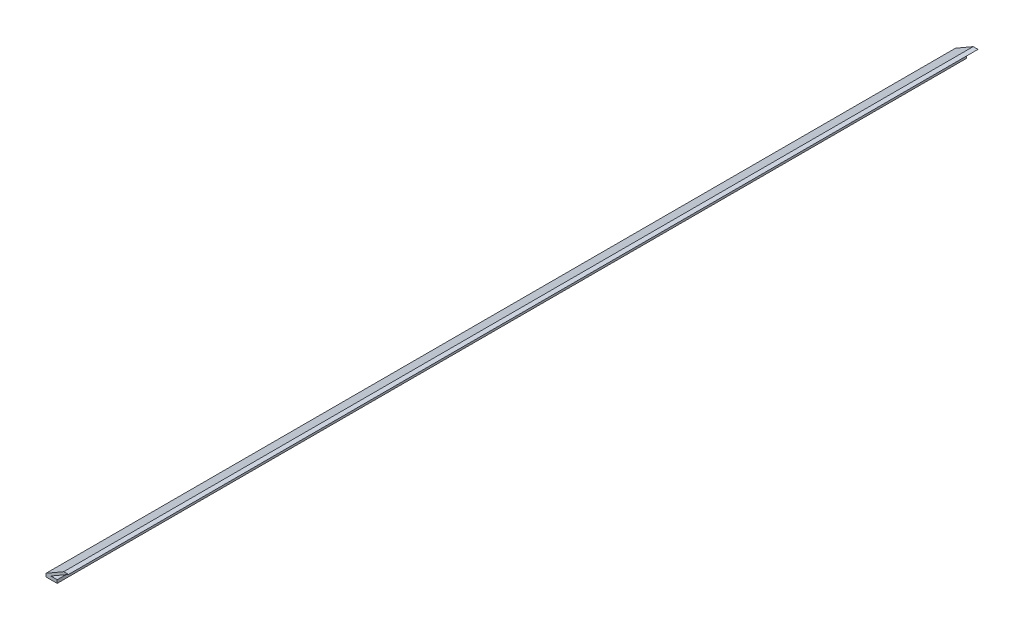
ISO-10303-21;
HEADER;
FILE_DESCRIPTION(('STEP AP214'),'2;1');
FILE_NAME('part.step','',(''),(''),'','','');
FILE_SCHEMA(('AUTOMOTIVE_DESIGN { 1 0 10303 214 1 1 1 1 }'));
ENDSEC;
DATA;
#1=APPLICATION_CONTEXT('core data for automotive mechanical design processes');
#2=APPLICATION_PROTOCOL_DEFINITION('international standard','automotive_design',2000,#1);
#3=PRODUCT_CONTEXT('',#1,'mechanical');
#4=PRODUCT('Part','Part','',(#3));
#5=PRODUCT_RELATED_PRODUCT_CATEGORY('part','',(#4));
#6=PRODUCT_DEFINITION_FORMATION('','',#4);
#7=PRODUCT_DEFINITION_CONTEXT('part definition',#1,'design');
#8=PRODUCT_DEFINITION('design','',#6,#7);
#9=PRODUCT_DEFINITION_SHAPE('','',#8);
#10=(LENGTH_UNIT() NAMED_UNIT(*) SI_UNIT(.MILLI.,.METRE.));
#11=(NAMED_UNIT(*) PLANE_ANGLE_UNIT() SI_UNIT($,.RADIAN.));
#12=(NAMED_UNIT(*) SI_UNIT($,.STERADIAN.) SOLID_ANGLE_UNIT());
#13=UNCERTAINTY_MEASURE_WITH_UNIT(LENGTH_MEASURE(1.E-05),#10,'distance_accuracy_value','');
#14=(GEOMETRIC_REPRESENTATION_CONTEXT(3) GLOBAL_UNCERTAINTY_ASSIGNED_CONTEXT((#13)) GLOBAL_UNIT_ASSIGNED_CONTEXT((#10,
#11,#12)) REPRESENTATION_CONTEXT('',''));
#15=CARTESIAN_POINT('',(0.,0.,0.));
#16=DIRECTION('',(0.,0.,1.));
#17=DIRECTION('',(1.,0.,0.));
#18=AXIS2_PLACEMENT_3D('',#15,#16,#17);
#19=CARTESIAN_POINT('',(-12.,-69.6978241287894,2850.));
#20=DIRECTION('',(1.,0.,0.));
#21=DIRECTION('',(0.,1.,0.));
#22=AXIS2_PLACEMENT_3D('',#19,#20,#21);
#23=PLANE('',#22);
#24=DIRECTION('',(0.,-1.,0.));
#25=VECTOR('',#24,1.);
#26=CARTESIAN_POINT('',(-12.,-69.6978241287894,0.));
#27=LINE('',#26,#25);
#28=CARTESIAN_POINT('',(-12.,-69.6978241287894,0.));
#29=VERTEX_POINT('',#28);
#30=CARTESIAN_POINT('',(-12.,-79.6978241287894,0.));
#31=VERTEX_POINT('',#30);
#32=EDGE_CURVE('E138',#29,#31,#27,.T.);
#33=ORIENTED_EDGE('',*,*,#32,.T.);
#34=DIRECTION('',(0.,0.,-1.));
#35=VECTOR('',#34,1.);
#36=CARTESIAN_POINT('',(-12.,-79.6978241287894,2850.));
#37=LINE('',#36,#35);
#38=CARTESIAN_POINT('',(-12.,-79.6978241287894,2850.));
#39=VERTEX_POINT('',#38);
#40=EDGE_CURVE('E11',#39,#31,#37,.T.);
#41=ORIENTED_EDGE('',*,*,#40,.F.);
#42=DIRECTION('',(0.,-1.,0.));
#43=VECTOR('',#42,1.);
#44=CARTESIAN_POINT('',(-12.,-69.6978241287894,2850.));
#45=LINE('',#44,#43);
#46=CARTESIAN_POINT('',(-12.,-69.6978241287894,2850.));
#47=VERTEX_POINT('',#46);
#48=EDGE_CURVE('E158',#47,#39,#45,.T.);
#49=ORIENTED_EDGE('',*,*,#48,.F.);
#50=DIRECTION('',(0.,0.,-1.));
#51=VECTOR('',#50,1.);
#52=CARTESIAN_POINT('',(-12.,-69.6978241287894,2850.));
#53=LINE('',#52,#51);
#54=EDGE_CURVE('E134',#47,#29,#53,.T.);
#55=ORIENTED_EDGE('',*,*,#54,.T.);
#56=EDGE_LOOP('',(#33,#41,#49,#55));
#57=FACE_BOUND('',#56,.T.);
#58=ADVANCED_FACE('F43',(#57),#23,.F.);
#59=CARTESIAN_POINT('',(-12.,-79.6978241287894,2850.));
#60=DIRECTION('',(0.,1.,0.));
#61=DIRECTION('',(0.,0.,1.));
#62=AXIS2_PLACEMENT_3D('',#59,#60,#61);
#63=PLANE('',#62);
#64=CARTESIAN_POINT('',(14.,-79.6978241287894,89.9999999999999));
#65=DIRECTION('',(0.,-1.,0.));
#66=DIRECTION('',(0.,0.,-1.));
#67=AXIS2_PLACEMENT_3D('',#64,#65,#66);
#68=CIRCLE('',#67,4.);
#69=CARTESIAN_POINT('',(14.,-79.6978241287894,85.9999999999999));
#70=VERTEX_POINT('',#69);
#71=EDGE_CURVE('E294',#70,#70,#68,.T.);
#72=ORIENTED_EDGE('',*,*,#71,.F.);
#73=EDGE_LOOP('',(#72));
#74=FACE_BOUND('',#73,.T.);
#75=CARTESIAN_POINT('',(14.,-79.6978241287894,290.));
#76=DIRECTION('',(0.,-1.,0.));
#77=DIRECTION('',(0.,0.,-1.));
#78=AXIS2_PLACEMENT_3D('',#75,#76,#77);
#79=CIRCLE('',#78,4.);
#80=CARTESIAN_POINT('',(14.,-79.6978241287894,286.));
#81=VERTEX_POINT('',#80);
#82=EDGE_CURVE('E286',#81,#81,#79,.T.);
#83=ORIENTED_EDGE('',*,*,#82,.F.);
#84=EDGE_LOOP('',(#83));
#85=FACE_BOUND('',#84,.T.);
#86=CARTESIAN_POINT('',(14.,-79.6978241287894,490.));
#87=DIRECTION('',(0.,-1.,0.));
#88=DIRECTION('',(0.,0.,-1.));
#89=AXIS2_PLACEMENT_3D('',#86,#87,#88);
#90=CIRCLE('',#89,4.);
#91=CARTESIAN_POINT('',(14.,-79.6978241287894,486.));
#92=VERTEX_POINT('',#91);
#93=EDGE_CURVE('E278',#92,#92,#90,.T.);
#94=ORIENTED_EDGE('',*,*,#93,.F.);
#95=EDGE_LOOP('',(#94));
#96=FACE_BOUND('',#95,.T.);
#97=CARTESIAN_POINT('',(14.,-79.6978241287894,690.));
#98=DIRECTION('',(0.,-1.,0.));
#99=DIRECTION('',(0.,0.,-1.));
#100=AXIS2_PLACEMENT_3D('',#97,#98,#99);
#101=CIRCLE('',#100,4.);
#102=CARTESIAN_POINT('',(14.,-79.6978241287894,686.));
#103=VERTEX_POINT('',#102);
#104=EDGE_CURVE('E270',#103,#103,#101,.T.);
#105=ORIENTED_EDGE('',*,*,#104,.F.);
#106=EDGE_LOOP('',(#105));
#107=FACE_BOUND('',#106,.T.);
#108=CARTESIAN_POINT('',(14.,-79.6978241287894,890.));
#109=DIRECTION('',(0.,-1.,0.));
#110=DIRECTION('',(0.,0.,-1.));
#111=AXIS2_PLACEMENT_3D('',#108,#109,#110);
#112=CIRCLE('',#111,4.);
#113=CARTESIAN_POINT('',(14.,-79.6978241287894,886.));
#114=VERTEX_POINT('',#113);
#115=EDGE_CURVE('E262',#114,#114,#112,.T.);
#116=ORIENTED_EDGE('',*,*,#115,.F.);
#117=EDGE_LOOP('',(#116));
#118=FACE_BOUND('',#117,.T.);
#119=CARTESIAN_POINT('',(14.,-79.6978241287894,1090.));
#120=DIRECTION('',(0.,-1.,0.));
#121=DIRECTION('',(0.,0.,-1.));
#122=AXIS2_PLACEMENT_3D('',#119,#120,#121);
#123=CIRCLE('',#122,4.);
#124=CARTESIAN_POINT('',(14.,-79.6978241287894,1086.));
#125=VERTEX_POINT('',#124);
#126=EDGE_CURVE('E254',#125,#125,#123,.T.);
#127=ORIENTED_EDGE('',*,*,#126,.F.);
#128=EDGE_LOOP('',(#127));
#129=FACE_BOUND('',#128,.T.);
#130=CARTESIAN_POINT('',(14.,-79.6978241287894,1290.));
#131=DIRECTION('',(0.,-1.,0.));
#132=DIRECTION('',(0.,0.,-1.));
#133=AXIS2_PLACEMENT_3D('',#130,#131,#132);
#134=CIRCLE('',#133,4.);
#135=CARTESIAN_POINT('',(14.,-79.6978241287894,1286.));
#136=VERTEX_POINT('',#135);
#137=EDGE_CURVE('E246',#136,#136,#134,.T.);
#138=ORIENTED_EDGE('',*,*,#137,.F.);
#139=EDGE_LOOP('',(#138));
#140=FACE_BOUND('',#139,.T.);
#141=CARTESIAN_POINT('',(14.,-79.6978241287894,1490.));
#142=DIRECTION('',(0.,-1.,0.));
#143=DIRECTION('',(0.,0.,-1.));
#144=AXIS2_PLACEMENT_3D('',#141,#142,#143);
#145=CIRCLE('',#144,4.);
#146=CARTESIAN_POINT('',(14.,-79.6978241287894,1486.));
#147=VERTEX_POINT('',#146);
#148=EDGE_CURVE('E238',#147,#147,#145,.T.);
#149=ORIENTED_EDGE('',*,*,#148,.F.);
#150=EDGE_LOOP('',(#149));
#151=FACE_BOUND('',#150,.T.);
#152=CARTESIAN_POINT('',(14.,-79.6978241287894,1690.));
#153=DIRECTION('',(0.,-1.,0.));
#154=DIRECTION('',(0.,0.,-1.));
#155=AXIS2_PLACEMENT_3D('',#152,#153,#154);
#156=CIRCLE('',#155,4.);
#157=CARTESIAN_POINT('',(14.,-79.6978241287894,1686.));
#158=VERTEX_POINT('',#157);
#159=EDGE_CURVE('E230',#158,#158,#156,.T.);
#160=ORIENTED_EDGE('',*,*,#159,.F.);
#161=EDGE_LOOP('',(#160));
#162=FACE_BOUND('',#161,.T.);
#163=CARTESIAN_POINT('',(14.,-79.6978241287894,1890.));
#164=DIRECTION('',(0.,-1.,0.));
#165=DIRECTION('',(0.,0.,-1.));
#166=AXIS2_PLACEMENT_3D('',#163,#164,#165);
#167=CIRCLE('',#166,4.);
#168=CARTESIAN_POINT('',(14.,-79.6978241287894,1886.));
#169=VERTEX_POINT('',#168);
#170=EDGE_CURVE('E222',#169,#169,#167,.T.);
#171=ORIENTED_EDGE('',*,*,#170,.F.);
#172=EDGE_LOOP('',(#171));
#173=FACE_BOUND('',#172,.T.);
#174=CARTESIAN_POINT('',(14.,-79.6978241287894,2090.));
#175=DIRECTION('',(0.,-1.,0.));
#176=DIRECTION('',(0.,0.,-1.));
#177=AXIS2_PLACEMENT_3D('',#174,#175,#176);
#178=CIRCLE('',#177,4.);
#179=CARTESIAN_POINT('',(14.,-79.6978241287894,2086.));
#180=VERTEX_POINT('',#179);
#181=EDGE_CURVE('E214',#180,#180,#178,.T.);
#182=ORIENTED_EDGE('',*,*,#181,.F.);
#183=EDGE_LOOP('',(#182));
#184=FACE_BOUND('',#183,.T.);
#185=CARTESIAN_POINT('',(14.,-79.6978241287894,2290.));
#186=DIRECTION('',(0.,-1.,0.));
#187=DIRECTION('',(0.,0.,-1.));
#188=AXIS2_PLACEMENT_3D('',#185,#186,#187);
#189=CIRCLE('',#188,4.);
#190=CARTESIAN_POINT('',(14.,-79.6978241287894,2286.));
#191=VERTEX_POINT('',#190);
#192=EDGE_CURVE('E206',#191,#191,#189,.T.);
#193=ORIENTED_EDGE('',*,*,#192,.F.);
#194=EDGE_LOOP('',(#193));
#195=FACE_BOUND('',#194,.T.);
#196=CARTESIAN_POINT('',(14.,-79.6978241287894,2490.));
#197=DIRECTION('',(0.,-1.,0.));
#198=DIRECTION('',(0.,0.,-1.));
#199=AXIS2_PLACEMENT_3D('',#196,#197,#198);
#200=CIRCLE('',#199,4.);
#201=CARTESIAN_POINT('',(14.,-79.6978241287894,2486.));
#202=VERTEX_POINT('',#201);
#203=EDGE_CURVE('E198',#202,#202,#200,.T.);
#204=ORIENTED_EDGE('',*,*,#203,.F.);
#205=EDGE_LOOP('',(#204));
#206=FACE_BOUND('',#205,.T.);
#207=CARTESIAN_POINT('',(14.,-79.6978241287894,2690.));
#208=DIRECTION('',(0.,-1.,0.));
#209=DIRECTION('',(0.,0.,-1.));
#210=AXIS2_PLACEMENT_3D('',#207,#208,#209);
#211=CIRCLE('',#210,4.);
#212=CARTESIAN_POINT('',(14.,-79.6978241287894,2686.));
#213=VERTEX_POINT('',#212);
#214=EDGE_CURVE('E190',#213,#213,#211,.T.);
#215=ORIENTED_EDGE('',*,*,#214,.F.);
#216=EDGE_LOOP('',(#215));
#217=FACE_BOUND('',#216,.T.);
#218=DIRECTION('',(1.,0.,0.));
#219=VECTOR('',#218,1.);
#220=CARTESIAN_POINT('',(-12.,-79.6978241287894,0.));
#221=LINE('',#220,#219);
#222=CARTESIAN_POINT('',(23.,-79.6978241287894,0.));
#223=VERTEX_POINT('',#222);
#224=EDGE_CURVE('E142',#31,#223,#221,.T.);
#225=ORIENTED_EDGE('',*,*,#224,.T.);
#226=DIRECTION('',(0.,0.,-1.));
#227=VECTOR('',#226,1.);
#228=CARTESIAN_POINT('',(23.,-79.6978241287894,2850.));
#229=LINE('',#228,#227);
#230=CARTESIAN_POINT('',(23.,-79.6978241287894,2850.));
#231=VERTEX_POINT('',#230);
#232=EDGE_CURVE('E52',#231,#223,#229,.T.);
#233=ORIENTED_EDGE('',*,*,#232,.F.);
#234=DIRECTION('',(1.,0.,0.));
#235=VECTOR('',#234,1.);
#236=CARTESIAN_POINT('',(-12.,-79.6978241287894,2850.));
#237=LINE('',#236,#235);
#238=EDGE_CURVE('E100',#39,#231,#237,.T.);
#239=ORIENTED_EDGE('',*,*,#238,.F.);
#240=ORIENTED_EDGE('',*,*,#40,.T.);
#241=EDGE_LOOP('',(#225,#233,#239,#240));
#242=FACE_BOUND('',#241,.T.);
#243=ADVANCED_FACE('F311',(#74,#85,#96,#107,#118,#129,#140,#151,#162,#173,#184,#195,#206,#217,
#242),#63,.F.);
#244=CARTESIAN_POINT('',(23.,-79.6978241287894,2850.));
#245=DIRECTION('',(-1.,0.,0.));
#246=DIRECTION('',(0.,-1.,0.));
#247=AXIS2_PLACEMENT_3D('',#244,#245,#246);
#248=PLANE('',#247);
#249=DIRECTION('',(0.,1.,0.));
#250=VECTOR('',#249,1.);
#251=CARTESIAN_POINT('',(23.,-79.6978241287894,0.));
#252=LINE('',#251,#250);
#253=CARTESIAN_POINT('',(23.,-69.6978241287894,0.));
#254=VERTEX_POINT('',#253);
#255=EDGE_CURVE('E146',#223,#254,#252,.T.);
#256=ORIENTED_EDGE('',*,*,#255,.T.);
#257=DIRECTION('',(0.,0.,-1.));
#258=VECTOR('',#257,1.);
#259=CARTESIAN_POINT('',(23.,-69.6978241287894,2850.));
#260=LINE('',#259,#258);
#261=CARTESIAN_POINT('',(23.,-69.6978241287894,2850.));
#262=VERTEX_POINT('',#261);
#263=EDGE_CURVE('E165',#262,#254,#260,.T.);
#264=ORIENTED_EDGE('',*,*,#263,.F.);
#265=DIRECTION('',(0.,1.,0.));
#266=VECTOR('',#265,1.);
#267=CARTESIAN_POINT('',(23.,-79.6978241287894,2850.));
#268=LINE('',#267,#266);
#269=EDGE_CURVE('E175',#231,#262,#268,.T.);
#270=ORIENTED_EDGE('',*,*,#269,.F.);
#271=ORIENTED_EDGE('',*,*,#232,.T.);
#272=EDGE_LOOP('',(#256,#264,#270,#271));
#273=FACE_BOUND('',#272,.T.);
#274=ADVANCED_FACE('F173',(#273),#248,.F.);
#275=CARTESIAN_POINT('',(23.,-69.6978241287894,2850.));
#276=DIRECTION('',(0.,-1.,0.));
#277=DIRECTION('',(0.,0.,-1.));
#278=AXIS2_PLACEMENT_3D('',#275,#276,#277);
#279=PLANE('',#278);
#280=CARTESIAN_POINT('',(14.,-69.6978241287894,89.9999999999999));
#281=DIRECTION('',(0.,-1.,0.));
#282=DIRECTION('',(0.,0.,-1.));
#283=AXIS2_PLACEMENT_3D('',#280,#281,#282);
#284=CIRCLE('',#283,4.);
#285=CARTESIAN_POINT('',(14.,-69.6978241287894,85.9999999999999));
#286=VERTEX_POINT('',#285);
#287=EDGE_CURVE('E143',#286,#286,#284,.T.);
#288=ORIENTED_EDGE('',*,*,#287,.T.);
#289=EDGE_LOOP('',(#288));
#290=FACE_BOUND('',#289,.T.);
#291=CARTESIAN_POINT('',(14.,-69.6978241287894,290.));
#292=DIRECTION('',(0.,-1.,0.));
#293=DIRECTION('',(0.,0.,-1.));
#294=AXIS2_PLACEMENT_3D('',#291,#292,#293);
#295=CIRCLE('',#294,4.);
#296=CARTESIAN_POINT('',(14.,-69.6978241287894,286.));
#297=VERTEX_POINT('',#296);
#298=EDGE_CURVE('E290',#297,#297,#295,.T.);
#299=ORIENTED_EDGE('',*,*,#298,.T.);
#300=EDGE_LOOP('',(#299));
#301=FACE_BOUND('',#300,.T.);
#302=CARTESIAN_POINT('',(14.,-69.6978241287894,490.));
#303=DIRECTION('',(0.,-1.,0.));
#304=DIRECTION('',(0.,0.,-1.));
#305=AXIS2_PLACEMENT_3D('',#302,#303,#304);
#306=CIRCLE('',#305,4.);
#307=CARTESIAN_POINT('',(14.,-69.6978241287894,486.));
#308=VERTEX_POINT('',#307);
#309=EDGE_CURVE('E282',#308,#308,#306,.T.);
#310=ORIENTED_EDGE('',*,*,#309,.T.);
#311=EDGE_LOOP('',(#310));
#312=FACE_BOUND('',#311,.T.);
#313=CARTESIAN_POINT('',(14.,-69.6978241287894,690.));
#314=DIRECTION('',(0.,-1.,0.));
#315=DIRECTION('',(0.,0.,-1.));
#316=AXIS2_PLACEMENT_3D('',#313,#314,#315);
#317=CIRCLE('',#316,4.);
#318=CARTESIAN_POINT('',(14.,-69.6978241287894,686.));
#319=VERTEX_POINT('',#318);
#320=EDGE_CURVE('E274',#319,#319,#317,.T.);
#321=ORIENTED_EDGE('',*,*,#320,.T.);
#322=EDGE_LOOP('',(#321));
#323=FACE_BOUND('',#322,.T.);
#324=CARTESIAN_POINT('',(14.,-69.6978241287894,890.));
#325=DIRECTION('',(0.,-1.,0.));
#326=DIRECTION('',(0.,0.,-1.));
#327=AXIS2_PLACEMENT_3D('',#324,#325,#326);
#328=CIRCLE('',#327,4.);
#329=CARTESIAN_POINT('',(14.,-69.6978241287894,886.));
#330=VERTEX_POINT('',#329);
#331=EDGE_CURVE('E266',#330,#330,#328,.T.);
#332=ORIENTED_EDGE('',*,*,#331,.T.);
#333=EDGE_LOOP('',(#332));
#334=FACE_BOUND('',#333,.T.);
#335=CARTESIAN_POINT('',(14.,-69.6978241287894,1090.));
#336=DIRECTION('',(0.,-1.,0.));
#337=DIRECTION('',(0.,0.,-1.));
#338=AXIS2_PLACEMENT_3D('',#335,#336,#337);
#339=CIRCLE('',#338,4.);
#340=CARTESIAN_POINT('',(14.,-69.6978241287894,1086.));
#341=VERTEX_POINT('',#340);
#342=EDGE_CURVE('E258',#341,#341,#339,.T.);
#343=ORIENTED_EDGE('',*,*,#342,.T.);
#344=EDGE_LOOP('',(#343));
#345=FACE_BOUND('',#344,.T.);
#346=CARTESIAN_POINT('',(14.,-69.6978241287894,1290.));
#347=DIRECTION('',(0.,-1.,0.));
#348=DIRECTION('',(0.,0.,-1.));
#349=AXIS2_PLACEMENT_3D('',#346,#347,#348);
#350=CIRCLE('',#349,4.);
#351=CARTESIAN_POINT('',(14.,-69.6978241287894,1286.));
#352=VERTEX_POINT('',#351);
#353=EDGE_CURVE('E250',#352,#352,#350,.T.);
#354=ORIENTED_EDGE('',*,*,#353,.T.);
#355=EDGE_LOOP('',(#354));
#356=FACE_BOUND('',#355,.T.);
#357=CARTESIAN_POINT('',(14.,-69.6978241287894,1490.));
#358=DIRECTION('',(0.,-1.,0.));
#359=DIRECTION('',(0.,0.,-1.));
#360=AXIS2_PLACEMENT_3D('',#357,#358,#359);
#361=CIRCLE('',#360,4.);
#362=CARTESIAN_POINT('',(14.,-69.6978241287894,1486.));
#363=VERTEX_POINT('',#362);
#364=EDGE_CURVE('E242',#363,#363,#361,.T.);
#365=ORIENTED_EDGE('',*,*,#364,.T.);
#366=EDGE_LOOP('',(#365));
#367=FACE_BOUND('',#366,.T.);
#368=CARTESIAN_POINT('',(14.,-69.6978241287894,1690.));
#369=DIRECTION('',(0.,-1.,0.));
#370=DIRECTION('',(0.,0.,-1.));
#371=AXIS2_PLACEMENT_3D('',#368,#369,#370);
#372=CIRCLE('',#371,4.);
#373=CARTESIAN_POINT('',(14.,-69.6978241287894,1686.));
#374=VERTEX_POINT('',#373);
#375=EDGE_CURVE('E234',#374,#374,#372,.T.);
#376=ORIENTED_EDGE('',*,*,#375,.T.);
#377=EDGE_LOOP('',(#376));
#378=FACE_BOUND('',#377,.T.);
#379=CARTESIAN_POINT('',(14.,-69.6978241287894,1890.));
#380=DIRECTION('',(0.,-1.,0.));
#381=DIRECTION('',(0.,0.,-1.));
#382=AXIS2_PLACEMENT_3D('',#379,#380,#381);
#383=CIRCLE('',#382,4.);
#384=CARTESIAN_POINT('',(14.,-69.6978241287894,1886.));
#385=VERTEX_POINT('',#384);
#386=EDGE_CURVE('E226',#385,#385,#383,.T.);
#387=ORIENTED_EDGE('',*,*,#386,.T.);
#388=EDGE_LOOP('',(#387));
#389=FACE_BOUND('',#388,.T.);
#390=CARTESIAN_POINT('',(14.,-69.6978241287894,2090.));
#391=DIRECTION('',(0.,-1.,0.));
#392=DIRECTION('',(0.,0.,-1.));
#393=AXIS2_PLACEMENT_3D('',#390,#391,#392);
#394=CIRCLE('',#393,4.);
#395=CARTESIAN_POINT('',(14.,-69.6978241287894,2086.));
#396=VERTEX_POINT('',#395);
#397=EDGE_CURVE('E218',#396,#396,#394,.T.);
#398=ORIENTED_EDGE('',*,*,#397,.T.);
#399=EDGE_LOOP('',(#398));
#400=FACE_BOUND('',#399,.T.);
#401=CARTESIAN_POINT('',(14.,-69.6978241287894,2290.));
#402=DIRECTION('',(0.,-1.,0.));
#403=DIRECTION('',(0.,0.,-1.));
#404=AXIS2_PLACEMENT_3D('',#401,#402,#403);
#405=CIRCLE('',#404,4.);
#406=CARTESIAN_POINT('',(14.,-69.6978241287894,2286.));
#407=VERTEX_POINT('',#406);
#408=EDGE_CURVE('E210',#407,#407,#405,.T.);
#409=ORIENTED_EDGE('',*,*,#408,.T.);
#410=EDGE_LOOP('',(#409));
#411=FACE_BOUND('',#410,.T.);
#412=CARTESIAN_POINT('',(14.,-69.6978241287894,2490.));
#413=DIRECTION('',(0.,-1.,0.));
#414=DIRECTION('',(0.,0.,-1.));
#415=AXIS2_PLACEMENT_3D('',#412,#413,#414);
#416=CIRCLE('',#415,4.);
#417=CARTESIAN_POINT('',(14.,-69.6978241287894,2486.));
#418=VERTEX_POINT('',#417);
#419=EDGE_CURVE('E202',#418,#418,#416,.T.);
#420=ORIENTED_EDGE('',*,*,#419,.T.);
#421=EDGE_LOOP('',(#420));
#422=FACE_BOUND('',#421,.T.);
#423=CARTESIAN_POINT('',(14.,-69.6978241287894,2690.));
#424=DIRECTION('',(0.,-1.,0.));
#425=DIRECTION('',(0.,0.,-1.));
#426=AXIS2_PLACEMENT_3D('',#423,#424,#425);
#427=CIRCLE('',#426,4.);
#428=CARTESIAN_POINT('',(14.,-69.6978241287894,2686.));
#429=VERTEX_POINT('',#428);
#430=EDGE_CURVE('E194',#429,#429,#427,.T.);
#431=ORIENTED_EDGE('',*,*,#430,.T.);
#432=EDGE_LOOP('',(#431));
#433=FACE_BOUND('',#432,.T.);
#434=DIRECTION('',(-1.,0.,0.));
#435=VECTOR('',#434,1.);
#436=CARTESIAN_POINT('',(23.,-69.6978241287894,0.));
#437=LINE('',#436,#435);
#438=CARTESIAN_POINT('',(3.,-69.6978241287894,0.));
#439=VERTEX_POINT('',#438);
#440=EDGE_CURVE('E149',#254,#439,#437,.T.);
#441=ORIENTED_EDGE('',*,*,#440,.T.);
#442=DIRECTION('',(0.,0.,-1.));
#443=VECTOR('',#442,1.);
#444=CARTESIAN_POINT('',(3.,-69.6978241287894,2850.));
#445=LINE('',#444,#443);
#446=CARTESIAN_POINT('',(3.,-69.6978241287894,2850.));
#447=VERTEX_POINT('',#446);
#448=EDGE_CURVE('E127',#447,#439,#445,.T.);
#449=ORIENTED_EDGE('',*,*,#448,.F.);
#450=DIRECTION('',(-1.,0.,0.));
#451=VECTOR('',#450,1.);
#452=CARTESIAN_POINT('',(23.,-69.6978241287894,2850.));
#453=LINE('',#452,#451);
#454=EDGE_CURVE('E116',#262,#447,#453,.T.);
#455=ORIENTED_EDGE('',*,*,#454,.F.);
#456=ORIENTED_EDGE('',*,*,#263,.T.);
#457=EDGE_LOOP('',(#441,#449,#455,#456));
#458=FACE_BOUND('',#457,.T.);
#459=ADVANCED_FACE('F181',(#290,#301,#312,#323,#334,#345,#356,#367,#378,#389,#400,#411,#422,
#433,#458),#279,.F.);
#460=CARTESIAN_POINT('',(3.,-69.6978241287894,2850.));
#461=DIRECTION('',(-0.499999999999995,0.866025403784441,0.));
#462=DIRECTION('',(-0.866025403784441,-0.499999999999995,0.));
#463=AXIS2_PLACEMENT_3D('',#460,#461,#462);
#464=PLANE('',#463);
#465=DIRECTION('',(0.866025403784441,0.499999999999995,0.));
#466=VECTOR('',#465,1.);
#467=CARTESIAN_POINT('',(3.,-69.6978241287894,0.));
#468=LINE('',#467,#466);
#469=CARTESIAN_POINT('',(58.5221907537824,-37.6420723510958,0.));
#470=VERTEX_POINT('',#469);
#471=EDGE_CURVE('E125',#439,#470,#468,.T.);
#472=ORIENTED_EDGE('',*,*,#471,.T.);
#473=DIRECTION('',(0.,0.,-1.));
#474=VECTOR('',#473,1.);
#475=CARTESIAN_POINT('',(58.5221907537824,-37.6420723510958,2850.));
#476=LINE('',#475,#474);
#477=CARTESIAN_POINT('',(58.5221907537824,-37.6420723510958,2850.));
#478=VERTEX_POINT('',#477);
#479=EDGE_CURVE('E122',#478,#470,#476,.T.);
#480=ORIENTED_EDGE('',*,*,#479,.F.);
#481=DIRECTION('',(0.866025403784441,0.499999999999995,0.));
#482=VECTOR('',#481,1.);
#483=CARTESIAN_POINT('',(3.,-69.6978241287894,2850.));
#484=LINE('',#483,#482);
#485=EDGE_CURVE('E110',#447,#478,#484,.T.);
#486=ORIENTED_EDGE('',*,*,#485,.F.);
#487=ORIENTED_EDGE('',*,*,#448,.T.);
#488=EDGE_LOOP('',(#472,#480,#486,#487));
#489=FACE_BOUND('',#488,.T.);
#490=ADVANCED_FACE('F123',(#489),#464,.F.);
#491=CARTESIAN_POINT('',(58.5221907537824,-37.6420723510958,2850.));
#492=DIRECTION('',(0.,-1.,0.));
#493=DIRECTION('',(0.,0.,-1.));
#494=AXIS2_PLACEMENT_3D('',#491,#492,#493);
#495=PLANE('',#494);
#496=DIRECTION('',(-1.,0.,0.));
#497=VECTOR('',#496,1.);
#498=CARTESIAN_POINT('',(58.5221907537824,-37.6420723510958,0.));
#499=LINE('',#498,#497);
#500=CARTESIAN_POINT('',(43.5221907537824,-37.6420723510958,0.));
#501=VERTEX_POINT('',#500);
#502=EDGE_CURVE('E86',#470,#501,#499,.T.);
#503=ORIENTED_EDGE('',*,*,#502,.T.);
#504=DIRECTION('',(0.,0.,-1.));
#505=VECTOR('',#504,1.);
#506=CARTESIAN_POINT('',(43.5221907537824,-37.6420723510958,2850.));
#507=LINE('',#506,#505);
#508=CARTESIAN_POINT('',(43.5221907537824,-37.6420723510958,2850.));
#509=VERTEX_POINT('',#508);
#510=EDGE_CURVE('E128',#509,#501,#507,.T.);
#511=ORIENTED_EDGE('',*,*,#510,.F.);
#512=DIRECTION('',(-1.,0.,0.));
#513=VECTOR('',#512,1.);
#514=CARTESIAN_POINT('',(58.5221907537824,-37.6420723510958,2850.));
#515=LINE('',#514,#513);
#516=EDGE_CURVE('E114',#478,#509,#515,.T.);
#517=ORIENTED_EDGE('',*,*,#516,.F.);
#518=ORIENTED_EDGE('',*,*,#479,.T.);
#519=EDGE_LOOP('',(#503,#511,#517,#518));
#520=FACE_BOUND('',#519,.T.);
#521=ADVANCED_FACE('F130',(#520),#495,.F.);
#522=CARTESIAN_POINT('',(43.5221907537824,-37.6420723510958,2850.));
#523=DIRECTION('',(0.499999999999995,-0.866025403784441,0.));
#524=DIRECTION('',(0.866025403784442,0.499999999999995,0.));
#525=AXIS2_PLACEMENT_3D('',#522,#523,#524);
#526=PLANE('',#525);
#527=DIRECTION('',(-0.866025403784442,-0.499999999999995,0.));
#528=VECTOR('',#527,1.);
#529=CARTESIAN_POINT('',(43.5221907537824,-37.6420723510958,0.));
#530=LINE('',#529,#528);
#531=EDGE_CURVE('E92',#501,#29,#530,.T.);
#532=ORIENTED_EDGE('',*,*,#531,.T.);
#533=ORIENTED_EDGE('',*,*,#54,.F.);
#534=DIRECTION('',(-0.866025403784442,-0.499999999999995,0.));
#535=VECTOR('',#534,1.);
#536=CARTESIAN_POINT('',(43.5221907537824,-37.6420723510958,2850.));
#537=LINE('',#536,#535);
#538=EDGE_CURVE('E60',#509,#47,#537,.T.);
#539=ORIENTED_EDGE('',*,*,#538,.F.);
#540=ORIENTED_EDGE('',*,*,#510,.T.);
#541=EDGE_LOOP('',(#532,#533,#539,#540));
#542=FACE_BOUND('',#541,.T.);
#543=ADVANCED_FACE('F342',(#542),#526,.F.);
#544=CARTESIAN_POINT('',(0.,0.,2850.));
#545=DIRECTION('',(0.,0.,1.));
#546=DIRECTION('',(1.,0.,0.));
#547=AXIS2_PLACEMENT_3D('',#544,#545,#546);
#548=PLANE('',#547);
#549=ORIENTED_EDGE('',*,*,#48,.T.);
#550=ORIENTED_EDGE('',*,*,#238,.T.);
#551=ORIENTED_EDGE('',*,*,#269,.T.);
#552=ORIENTED_EDGE('',*,*,#454,.T.);
#553=ORIENTED_EDGE('',*,*,#485,.T.);
#554=ORIENTED_EDGE('',*,*,#516,.T.);
#555=ORIENTED_EDGE('',*,*,#538,.T.);
#556=EDGE_LOOP('',(#549,#550,#551,#552,#553,#554,#555));
#557=FACE_BOUND('',#556,.T.);
#558=ADVANCED_FACE('F112',(#557),#548,.T.);
#559=CARTESIAN_POINT('',(0.,0.,0.));
#560=DIRECTION('',(0.,0.,1.));
#561=DIRECTION('',(1.,0.,0.));
#562=AXIS2_PLACEMENT_3D('',#559,#560,#561);
#563=PLANE('',#562);
#564=ORIENTED_EDGE('',*,*,#32,.F.);
#565=ORIENTED_EDGE('',*,*,#531,.F.);
#566=ORIENTED_EDGE('',*,*,#502,.F.);
#567=ORIENTED_EDGE('',*,*,#471,.F.);
#568=ORIENTED_EDGE('',*,*,#440,.F.);
#569=ORIENTED_EDGE('',*,*,#255,.F.);
#570=ORIENTED_EDGE('',*,*,#224,.F.);
#571=EDGE_LOOP('',(#564,#565,#566,#567,#568,#569,#570));
#572=FACE_BOUND('',#571,.T.);
#573=ADVANCED_FACE('F179',(#572),#563,.F.);
#574=CARTESIAN_POINT('',(14.,-69.6978241287894,2690.));
#575=DIRECTION('',(0.,-1.,0.));
#576=DIRECTION('',(0.,0.,-1.));
#577=AXIS2_PLACEMENT_3D('',#574,#575,#576);
#578=CYLINDRICAL_SURFACE('',#577,4.);
#579=ORIENTED_EDGE('',*,*,#430,.F.);
#580=EDGE_LOOP('',(#579));
#581=FACE_BOUND('',#580,.T.);
#582=ORIENTED_EDGE('',*,*,#214,.T.);
#583=EDGE_LOOP('',(#582));
#584=FACE_BOUND('',#583,.T.);
#585=ADVANCED_FACE('F400',(#581,#584),#578,.F.);
#586=CARTESIAN_POINT('',(14.,-69.6978241287894,2490.));
#587=DIRECTION('',(0.,-1.,0.));
#588=DIRECTION('',(0.,0.,-1.));
#589=AXIS2_PLACEMENT_3D('',#586,#587,#588);
#590=CYLINDRICAL_SURFACE('',#589,4.);
#591=ORIENTED_EDGE('',*,*,#419,.F.);
#592=EDGE_LOOP('',(#591));
#593=FACE_BOUND('',#592,.T.);
#594=ORIENTED_EDGE('',*,*,#203,.T.);
#595=EDGE_LOOP('',(#594));
#596=FACE_BOUND('',#595,.T.);
#597=ADVANCED_FACE('F408',(#593,#596),#590,.F.);
#598=CARTESIAN_POINT('',(14.,-69.6978241287894,2290.));
#599=DIRECTION('',(0.,-1.,0.));
#600=DIRECTION('',(0.,0.,-1.));
#601=AXIS2_PLACEMENT_3D('',#598,#599,#600);
#602=CYLINDRICAL_SURFACE('',#601,4.);
#603=ORIENTED_EDGE('',*,*,#408,.F.);
#604=EDGE_LOOP('',(#603));
#605=FACE_BOUND('',#604,.T.);
#606=ORIENTED_EDGE('',*,*,#192,.T.);
#607=EDGE_LOOP('',(#606));
#608=FACE_BOUND('',#607,.T.);
#609=ADVANCED_FACE('F415',(#605,#608),#602,.F.);
#610=CARTESIAN_POINT('',(14.,-69.6978241287894,2090.));
#611=DIRECTION('',(0.,-1.,0.));
#612=DIRECTION('',(0.,0.,-1.));
#613=AXIS2_PLACEMENT_3D('',#610,#611,#612);
#614=CYLINDRICAL_SURFACE('',#613,4.);
#615=ORIENTED_EDGE('',*,*,#397,.F.);
#616=EDGE_LOOP('',(#615));
#617=FACE_BOUND('',#616,.T.);
#618=ORIENTED_EDGE('',*,*,#181,.T.);
#619=EDGE_LOOP('',(#618));
#620=FACE_BOUND('',#619,.T.);
#621=ADVANCED_FACE('F423',(#617,#620),#614,.F.);
#622=CARTESIAN_POINT('',(14.,-69.6978241287894,1890.));
#623=DIRECTION('',(0.,-1.,0.));
#624=DIRECTION('',(0.,0.,-1.));
#625=AXIS2_PLACEMENT_3D('',#622,#623,#624);
#626=CYLINDRICAL_SURFACE('',#625,4.);
#627=ORIENTED_EDGE('',*,*,#386,.F.);
#628=EDGE_LOOP('',(#627));
#629=FACE_BOUND('',#628,.T.);
#630=ORIENTED_EDGE('',*,*,#170,.T.);
#631=EDGE_LOOP('',(#630));
#632=FACE_BOUND('',#631,.T.);
#633=ADVANCED_FACE('F431',(#629,#632),#626,.F.);
#634=CARTESIAN_POINT('',(14.,-69.6978241287894,1690.));
#635=DIRECTION('',(0.,-1.,0.));
#636=DIRECTION('',(0.,0.,-1.));
#637=AXIS2_PLACEMENT_3D('',#634,#635,#636);
#638=CYLINDRICAL_SURFACE('',#637,4.);
#639=ORIENTED_EDGE('',*,*,#375,.F.);
#640=EDGE_LOOP('',(#639));
#641=FACE_BOUND('',#640,.T.);
#642=ORIENTED_EDGE('',*,*,#159,.T.);
#643=EDGE_LOOP('',(#642));
#644=FACE_BOUND('',#643,.T.);
#645=ADVANCED_FACE('F439',(#641,#644),#638,.F.);
#646=CARTESIAN_POINT('',(14.,-69.6978241287894,1490.));
#647=DIRECTION('',(0.,-1.,0.));
#648=DIRECTION('',(0.,0.,-1.));
#649=AXIS2_PLACEMENT_3D('',#646,#647,#648);
#650=CYLINDRICAL_SURFACE('',#649,4.);
#651=ORIENTED_EDGE('',*,*,#364,.F.);
#652=EDGE_LOOP('',(#651));
#653=FACE_BOUND('',#652,.T.);
#654=ORIENTED_EDGE('',*,*,#148,.T.);
#655=EDGE_LOOP('',(#654));
#656=FACE_BOUND('',#655,.T.);
#657=ADVANCED_FACE('F447',(#653,#656),#650,.F.);
#658=CARTESIAN_POINT('',(14.,-69.6978241287894,1290.));
#659=DIRECTION('',(0.,-1.,0.));
#660=DIRECTION('',(0.,0.,-1.));
#661=AXIS2_PLACEMENT_3D('',#658,#659,#660);
#662=CYLINDRICAL_SURFACE('',#661,4.);
#663=ORIENTED_EDGE('',*,*,#353,.F.);
#664=EDGE_LOOP('',(#663));
#665=FACE_BOUND('',#664,.T.);
#666=ORIENTED_EDGE('',*,*,#137,.T.);
#667=EDGE_LOOP('',(#666));
#668=FACE_BOUND('',#667,.T.);
#669=ADVANCED_FACE('F455',(#665,#668),#662,.F.);
#670=CARTESIAN_POINT('',(14.,-69.6978241287894,1090.));
#671=DIRECTION('',(0.,-1.,0.));
#672=DIRECTION('',(0.,0.,-1.));
#673=AXIS2_PLACEMENT_3D('',#670,#671,#672);
#674=CYLINDRICAL_SURFACE('',#673,4.);
#675=ORIENTED_EDGE('',*,*,#342,.F.);
#676=EDGE_LOOP('',(#675));
#677=FACE_BOUND('',#676,.T.);
#678=ORIENTED_EDGE('',*,*,#126,.T.);
#679=EDGE_LOOP('',(#678));
#680=FACE_BOUND('',#679,.T.);
#681=ADVANCED_FACE('F463',(#677,#680),#674,.F.);
#682=CARTESIAN_POINT('',(14.,-69.6978241287894,890.));
#683=DIRECTION('',(0.,-1.,0.));
#684=DIRECTION('',(0.,0.,-1.));
#685=AXIS2_PLACEMENT_3D('',#682,#683,#684);
#686=CYLINDRICAL_SURFACE('',#685,4.);
#687=ORIENTED_EDGE('',*,*,#331,.F.);
#688=EDGE_LOOP('',(#687));
#689=FACE_BOUND('',#688,.T.);
#690=ORIENTED_EDGE('',*,*,#115,.T.);
#691=EDGE_LOOP('',(#690));
#692=FACE_BOUND('',#691,.T.);
#693=ADVANCED_FACE('F471',(#689,#692),#686,.F.);
#694=CARTESIAN_POINT('',(14.,-69.6978241287894,690.));
#695=DIRECTION('',(0.,-1.,0.));
#696=DIRECTION('',(0.,0.,-1.));
#697=AXIS2_PLACEMENT_3D('',#694,#695,#696);
#698=CYLINDRICAL_SURFACE('',#697,4.);
#699=ORIENTED_EDGE('',*,*,#320,.F.);
#700=EDGE_LOOP('',(#699));
#701=FACE_BOUND('',#700,.T.);
#702=ORIENTED_EDGE('',*,*,#104,.T.);
#703=EDGE_LOOP('',(#702));
#704=FACE_BOUND('',#703,.T.);
#705=ADVANCED_FACE('F479',(#701,#704),#698,.F.);
#706=CARTESIAN_POINT('',(14.,-69.6978241287894,490.));
#707=DIRECTION('',(0.,-1.,0.));
#708=DIRECTION('',(0.,0.,-1.));
#709=AXIS2_PLACEMENT_3D('',#706,#707,#708);
#710=CYLINDRICAL_SURFACE('',#709,4.);
#711=ORIENTED_EDGE('',*,*,#309,.F.);
#712=EDGE_LOOP('',(#711));
#713=FACE_BOUND('',#712,.T.);
#714=ORIENTED_EDGE('',*,*,#93,.T.);
#715=EDGE_LOOP('',(#714));
#716=FACE_BOUND('',#715,.T.);
#717=ADVANCED_FACE('F487',(#713,#716),#710,.F.);
#718=CARTESIAN_POINT('',(14.,-69.6978241287894,290.));
#719=DIRECTION('',(0.,-1.,0.));
#720=DIRECTION('',(0.,0.,-1.));
#721=AXIS2_PLACEMENT_3D('',#718,#719,#720);
#722=CYLINDRICAL_SURFACE('',#721,4.);
#723=ORIENTED_EDGE('',*,*,#298,.F.);
#724=EDGE_LOOP('',(#723));
#725=FACE_BOUND('',#724,.T.);
#726=ORIENTED_EDGE('',*,*,#82,.T.);
#727=EDGE_LOOP('',(#726));
#728=FACE_BOUND('',#727,.T.);
#729=ADVANCED_FACE('F307',(#725,#728),#722,.F.);
#730=CARTESIAN_POINT('',(14.,-69.6978241287894,89.9999999999999));
#731=DIRECTION('',(0.,-1.,0.));
#732=DIRECTION('',(0.,0.,-1.));
#733=AXIS2_PLACEMENT_3D('',#730,#731,#732);
#734=CYLINDRICAL_SURFACE('',#733,4.);
#735=ORIENTED_EDGE('',*,*,#287,.F.);
#736=EDGE_LOOP('',(#735));
#737=FACE_BOUND('',#736,.T.);
#738=ORIENTED_EDGE('',*,*,#71,.T.);
#739=EDGE_LOOP('',(#738));
#740=FACE_BOUND('',#739,.T.);
#741=ADVANCED_FACE('F304',(#737,#740),#734,.F.);
#742=CLOSED_SHELL('',(#58,#243,#274,#459,#490,#521,#543,#558,#573,#585,#597,#609,#621,#633,#645,
#657,#669,#681,#693,#705,#717,#729,#741));
#743=MANIFOLD_SOLID_BREP('B2',#742);
#744=ADVANCED_BREP_SHAPE_REPRESENTATION('',(#18,#743),#14);
#745=SHAPE_DEFINITION_REPRESENTATION(#9,#744);
ENDSEC;
END-ISO-10303-21;
